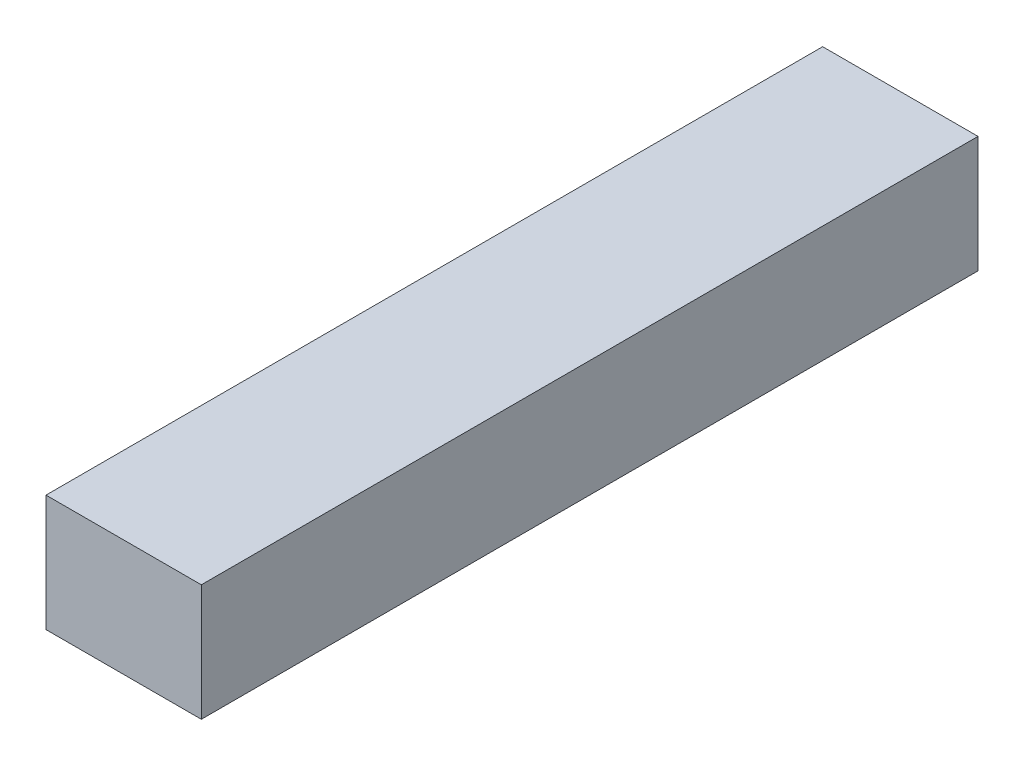
ISO-10303-21;
HEADER;
FILE_DESCRIPTION(('STEP AP214'),'2;1');
FILE_NAME('part.step','',(''),(''),'','','');
FILE_SCHEMA(('AUTOMOTIVE_DESIGN { 1 0 10303 214 1 1 1 1 }'));
ENDSEC;
DATA;
#1=APPLICATION_CONTEXT('core data for automotive mechanical design processes');
#2=APPLICATION_PROTOCOL_DEFINITION('international standard','automotive_design',2000,#1);
#3=PRODUCT_CONTEXT('',#1,'mechanical');
#4=PRODUCT('Part','Part','',(#3));
#5=PRODUCT_RELATED_PRODUCT_CATEGORY('part','',(#4));
#6=PRODUCT_DEFINITION_FORMATION('','',#4);
#7=PRODUCT_DEFINITION_CONTEXT('part definition',#1,'design');
#8=PRODUCT_DEFINITION('design','',#6,#7);
#9=PRODUCT_DEFINITION_SHAPE('','',#8);
#10=(LENGTH_UNIT() NAMED_UNIT(*) SI_UNIT(.MILLI.,.METRE.));
#11=(NAMED_UNIT(*) PLANE_ANGLE_UNIT() SI_UNIT($,.RADIAN.));
#12=(NAMED_UNIT(*) SI_UNIT($,.STERADIAN.) SOLID_ANGLE_UNIT());
#13=UNCERTAINTY_MEASURE_WITH_UNIT(LENGTH_MEASURE(1.E-05),#10,'distance_accuracy_value','');
#14=(GEOMETRIC_REPRESENTATION_CONTEXT(3) GLOBAL_UNCERTAINTY_ASSIGNED_CONTEXT((#13)) GLOBAL_UNIT_ASSIGNED_CONTEXT((#10,
#11,#12)) REPRESENTATION_CONTEXT('',''));
#15=CARTESIAN_POINT('',(0.,0.,0.));
#16=DIRECTION('',(0.,0.,1.));
#17=DIRECTION('',(1.,0.,0.));
#18=AXIS2_PLACEMENT_3D('',#15,#16,#17);
#19=CARTESIAN_POINT('',(-10.,15.,-100.));
#20=DIRECTION('',(1.,0.,0.));
#21=DIRECTION('',(0.,0.,-1.));
#22=AXIS2_PLACEMENT_3D('',#19,#20,#21);
#23=PLANE('',#22);
#24=DIRECTION('',(0.,0.,1.));
#25=VECTOR('',#24,1.);
#26=CARTESIAN_POINT('',(-10.,0.,-100.));
#27=LINE('',#26,#25);
#28=CARTESIAN_POINT('',(-10.,0.,-100.));
#29=VERTEX_POINT('',#28);
#30=CARTESIAN_POINT('',(-10.,0.,0.));
#31=VERTEX_POINT('',#30);
#32=EDGE_CURVE('E104',#29,#31,#27,.T.);
#33=ORIENTED_EDGE('',*,*,#32,.T.);
#34=DIRECTION('',(0.,-1.,0.));
#35=VECTOR('',#34,1.);
#36=CARTESIAN_POINT('',(-10.,15.,0.));
#37=LINE('',#36,#35);
#38=CARTESIAN_POINT('',(-10.,15.,0.));
#39=VERTEX_POINT('',#38);
#40=EDGE_CURVE('E11',#39,#31,#37,.T.);
#41=ORIENTED_EDGE('',*,*,#40,.F.);
#42=DIRECTION('',(0.,0.,1.));
#43=VECTOR('',#42,1.);
#44=CARTESIAN_POINT('',(-10.,15.,-100.));
#45=LINE('',#44,#43);
#46=CARTESIAN_POINT('',(-10.,15.,-100.));
#47=VERTEX_POINT('',#46);
#48=EDGE_CURVE('E92',#47,#39,#45,.T.);
#49=ORIENTED_EDGE('',*,*,#48,.F.);
#50=DIRECTION('',(0.,-1.,0.));
#51=VECTOR('',#50,1.);
#52=CARTESIAN_POINT('',(-10.,15.,-100.));
#53=LINE('',#52,#51);
#54=EDGE_CURVE('E100',#47,#29,#53,.T.);
#55=ORIENTED_EDGE('',*,*,#54,.T.);
#56=EDGE_LOOP('',(#33,#41,#49,#55));
#57=FACE_BOUND('',#56,.T.);
#58=ADVANCED_FACE('F41',(#57),#23,.F.);
#59=CARTESIAN_POINT('',(-10.,15.,0.));
#60=DIRECTION('',(0.,0.,-1.));
#61=DIRECTION('',(-1.,0.,0.));
#62=AXIS2_PLACEMENT_3D('',#59,#60,#61);
#63=PLANE('',#62);
#64=DIRECTION('',(1.,0.,0.));
#65=VECTOR('',#64,1.);
#66=CARTESIAN_POINT('',(-10.,0.,0.));
#67=LINE('',#66,#65);
#68=CARTESIAN_POINT('',(10.,0.,0.));
#69=VERTEX_POINT('',#68);
#70=EDGE_CURVE('E96',#31,#69,#67,.T.);
#71=ORIENTED_EDGE('',*,*,#70,.T.);
#72=DIRECTION('',(0.,-1.,0.));
#73=VECTOR('',#72,1.);
#74=CARTESIAN_POINT('',(10.,15.,0.));
#75=LINE('',#74,#73);
#76=CARTESIAN_POINT('',(10.,15.,0.));
#77=VERTEX_POINT('',#76);
#78=EDGE_CURVE('E49',#77,#69,#75,.T.);
#79=ORIENTED_EDGE('',*,*,#78,.F.);
#80=DIRECTION('',(1.,0.,0.));
#81=VECTOR('',#80,1.);
#82=CARTESIAN_POINT('',(-10.,15.,0.));
#83=LINE('',#82,#81);
#84=EDGE_CURVE('E87',#39,#77,#83,.T.);
#85=ORIENTED_EDGE('',*,*,#84,.F.);
#86=ORIENTED_EDGE('',*,*,#40,.T.);
#87=EDGE_LOOP('',(#71,#79,#85,#86));
#88=FACE_BOUND('',#87,.T.);
#89=ADVANCED_FACE('F95',(#88),#63,.F.);
#90=CARTESIAN_POINT('',(9.99999999999998,15.,-100.));
#91=DIRECTION('',(-1.,0.,0.));
#92=DIRECTION('',(0.,0.,1.));
#93=AXIS2_PLACEMENT_3D('',#90,#91,#92);
#94=PLANE('',#93);
#95=DIRECTION('',(0.,0.,-1.));
#96=VECTOR('',#95,1.);
#97=CARTESIAN_POINT('',(9.99999999999998,0.,-100.));
#98=LINE('',#97,#96);
#99=CARTESIAN_POINT('',(9.99999999999998,0.,-100.));
#100=VERTEX_POINT('',#99);
#101=EDGE_CURVE('E74',#69,#100,#98,.T.);
#102=ORIENTED_EDGE('',*,*,#101,.T.);
#103=DIRECTION('',(0.,-1.,0.));
#104=VECTOR('',#103,1.);
#105=CARTESIAN_POINT('',(9.99999999999998,15.,-100.));
#106=LINE('',#105,#104);
#107=CARTESIAN_POINT('',(9.99999999999998,15.,-100.));
#108=VERTEX_POINT('',#107);
#109=EDGE_CURVE('E97',#108,#100,#106,.T.);
#110=ORIENTED_EDGE('',*,*,#109,.F.);
#111=DIRECTION('',(0.,0.,-1.));
#112=VECTOR('',#111,1.);
#113=CARTESIAN_POINT('',(9.99999999999998,15.,-100.));
#114=LINE('',#113,#112);
#115=EDGE_CURVE('E90',#77,#108,#114,.T.);
#116=ORIENTED_EDGE('',*,*,#115,.F.);
#117=ORIENTED_EDGE('',*,*,#78,.T.);
#118=EDGE_LOOP('',(#102,#110,#116,#117));
#119=FACE_BOUND('',#118,.T.);
#120=ADVANCED_FACE('F98',(#119),#94,.F.);
#121=CARTESIAN_POINT('',(-10.,15.,-100.));
#122=DIRECTION('',(0.,0.,1.));
#123=DIRECTION('',(1.,0.,0.));
#124=AXIS2_PLACEMENT_3D('',#121,#122,#123);
#125=PLANE('',#124);
#126=DIRECTION('',(-1.,0.,0.));
#127=VECTOR('',#126,1.);
#128=CARTESIAN_POINT('',(-10.,0.,-100.));
#129=LINE('',#128,#127);
#130=EDGE_CURVE('E80',#100,#29,#129,.T.);
#131=ORIENTED_EDGE('',*,*,#130,.T.);
#132=ORIENTED_EDGE('',*,*,#54,.F.);
#133=DIRECTION('',(-1.,0.,0.));
#134=VECTOR('',#133,1.);
#135=CARTESIAN_POINT('',(-10.,15.,-100.));
#136=LINE('',#135,#134);
#137=EDGE_CURVE('E57',#108,#47,#136,.T.);
#138=ORIENTED_EDGE('',*,*,#137,.F.);
#139=ORIENTED_EDGE('',*,*,#109,.T.);
#140=EDGE_LOOP('',(#131,#132,#138,#139));
#141=FACE_BOUND('',#140,.T.);
#142=ADVANCED_FACE('F111',(#141),#125,.F.);
#143=CARTESIAN_POINT('',(0.,15.,0.));
#144=DIRECTION('',(0.,1.,0.));
#145=DIRECTION('',(0.,0.,1.));
#146=AXIS2_PLACEMENT_3D('',#143,#144,#145);
#147=PLANE('',#146);
#148=ORIENTED_EDGE('',*,*,#48,.T.);
#149=ORIENTED_EDGE('',*,*,#84,.T.);
#150=ORIENTED_EDGE('',*,*,#115,.T.);
#151=ORIENTED_EDGE('',*,*,#137,.T.);
#152=EDGE_LOOP('',(#148,#149,#150,#151));
#153=FACE_BOUND('',#152,.T.);
#154=ADVANCED_FACE('F88',(#153),#147,.T.);
#155=CARTESIAN_POINT('',(0.,0.,0.));
#156=DIRECTION('',(0.,1.,0.));
#157=DIRECTION('',(0.,0.,1.));
#158=AXIS2_PLACEMENT_3D('',#155,#156,#157);
#159=PLANE('',#158);
#160=ORIENTED_EDGE('',*,*,#32,.F.);
#161=ORIENTED_EDGE('',*,*,#130,.F.);
#162=ORIENTED_EDGE('',*,*,#101,.F.);
#163=ORIENTED_EDGE('',*,*,#70,.F.);
#164=EDGE_LOOP('',(#160,#161,#162,#163));
#165=FACE_BOUND('',#164,.T.);
#166=ADVANCED_FACE('F114',(#165),#159,.F.);
#167=CLOSED_SHELL('',(#58,#89,#120,#142,#154,#166));
#168=MANIFOLD_SOLID_BREP('B2',#167);
#169=ADVANCED_BREP_SHAPE_REPRESENTATION('',(#18,#168),#14);
#170=SHAPE_DEFINITION_REPRESENTATION(#9,#169);
ENDSEC;
END-ISO-10303-21;
